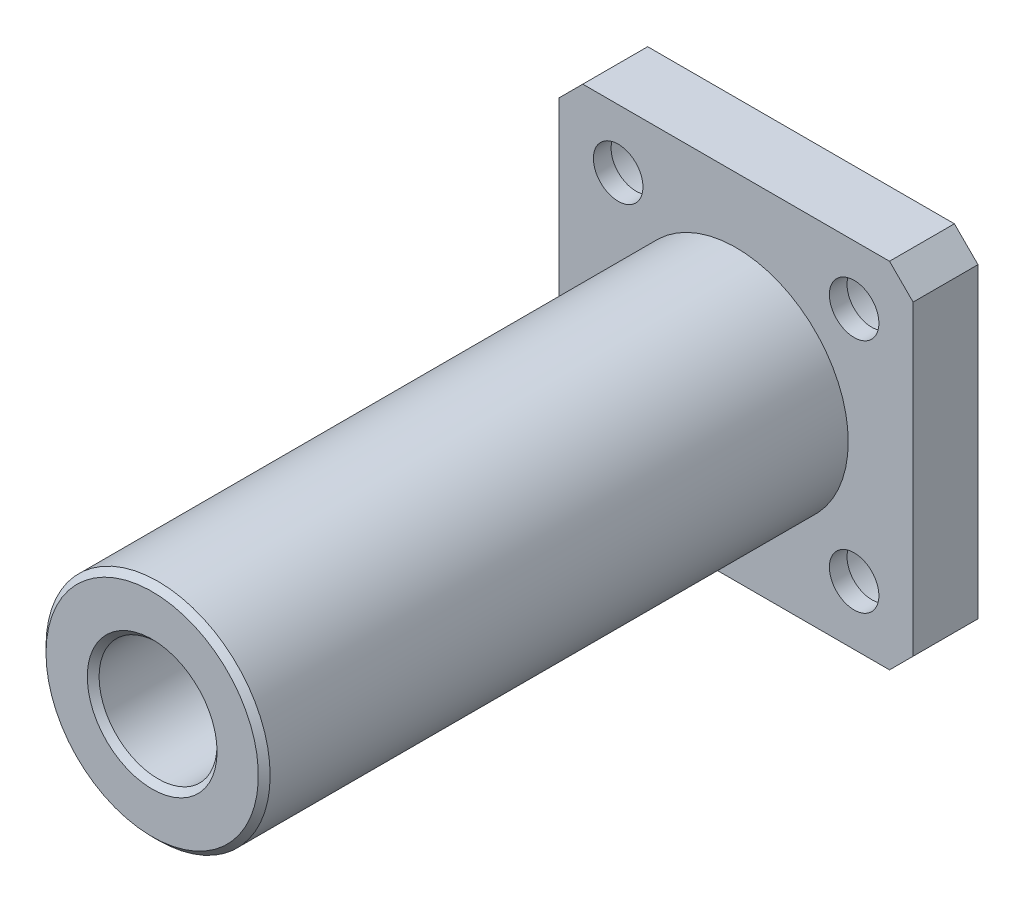
ISO-10303-21;
HEADER;
FILE_DESCRIPTION(('STEP AP214'),'2;1');
FILE_NAME('part.step','',(''),(''),'','','');
FILE_SCHEMA(('AUTOMOTIVE_DESIGN { 1 0 10303 214 1 1 1 1 }'));
ENDSEC;
DATA;
#1=APPLICATION_CONTEXT('core data for automotive mechanical design processes');
#2=APPLICATION_PROTOCOL_DEFINITION('international standard','automotive_design',2000,#1);
#3=PRODUCT_CONTEXT('',#1,'mechanical');
#4=PRODUCT('Part','Part','',(#3));
#5=PRODUCT_RELATED_PRODUCT_CATEGORY('part','',(#4));
#6=PRODUCT_DEFINITION_FORMATION('','',#4);
#7=PRODUCT_DEFINITION_CONTEXT('part definition',#1,'design');
#8=PRODUCT_DEFINITION('design','',#6,#7);
#9=PRODUCT_DEFINITION_SHAPE('','',#8);
#10=(LENGTH_UNIT() NAMED_UNIT(*) SI_UNIT(.MILLI.,.METRE.));
#11=(NAMED_UNIT(*) PLANE_ANGLE_UNIT() SI_UNIT($,.RADIAN.));
#12=(NAMED_UNIT(*) SI_UNIT($,.STERADIAN.) SOLID_ANGLE_UNIT());
#13=UNCERTAINTY_MEASURE_WITH_UNIT(LENGTH_MEASURE(1.E-05),#10,'distance_accuracy_value','');
#14=(GEOMETRIC_REPRESENTATION_CONTEXT(3) GLOBAL_UNCERTAINTY_ASSIGNED_CONTEXT((#13)) GLOBAL_UNIT_ASSIGNED_CONTEXT((#10,
#11,#12)) REPRESENTATION_CONTEXT('',''));
#15=CARTESIAN_POINT('',(0.,0.,0.));
#16=DIRECTION('',(0.,0.,1.));
#17=DIRECTION('',(1.,0.,0.));
#18=AXIS2_PLACEMENT_3D('',#15,#16,#17);
#19=CARTESIAN_POINT('',(0.,0.,0.));
#20=DIRECTION('',(0.,0.,-1.));
#21=DIRECTION('',(-1.,0.,0.));
#22=AXIS2_PLACEMENT_3D('',#19,#20,#21);
#23=CONICAL_SURFACE('',#22,5.49999999998363,0.785398163397448);
#24=CARTESIAN_POINT('',(0.,0.,0.));
#25=DIRECTION('',(0.,0.,-1.));
#26=DIRECTION('',(-1.,0.,0.));
#27=AXIS2_PLACEMENT_3D('',#24,#25,#26);
#28=CIRCLE('',#27,5.49999999998363);
#29=CARTESIAN_POINT('',(-5.49999999998363,0.,0.));
#30=VERTEX_POINT('',#29);
#31=EDGE_CURVE('E193',#30,#30,#28,.T.);
#32=ORIENTED_EDGE('',*,*,#31,.T.);
#33=EDGE_LOOP('',(#32));
#34=FACE_BOUND('',#33,.T.);
#35=CARTESIAN_POINT('',(0.,0.,0.5));
#36=DIRECTION('',(0.,0.,-1.));
#37=DIRECTION('',(-1.,0.,0.));
#38=AXIS2_PLACEMENT_3D('',#35,#36,#37);
#39=CIRCLE('',#38,5.);
#40=CARTESIAN_POINT('',(-5.,0.,0.5));
#41=VERTEX_POINT('',#40);
#42=EDGE_CURVE('E113',#41,#41,#39,.F.);
#43=ORIENTED_EDGE('',*,*,#42,.T.);
#44=EDGE_LOOP('',(#43));
#45=FACE_BOUND('',#44,.T.);
#46=ADVANCED_FACE('F17',(#34,#45),#23,.F.);
#47=CARTESIAN_POINT('',(-10.,-10.,2.));
#48=DIRECTION('',(0.,0.,-1.));
#49=DIRECTION('',(-1.,0.,0.));
#50=AXIS2_PLACEMENT_3D('',#47,#48,#49);
#51=CYLINDRICAL_SURFACE('',#50,4.);
#52=CARTESIAN_POINT('',(-10.,-10.,4.));
#53=DIRECTION('',(0.,0.,-1.));
#54=DIRECTION('',(-1.,0.,0.));
#55=AXIS2_PLACEMENT_3D('',#52,#53,#54);
#56=CIRCLE('',#55,4.);
#57=CARTESIAN_POINT('',(-14.,-10.,4.));
#58=VERTEX_POINT('',#57);
#59=EDGE_CURVE('E188',#58,#58,#56,.T.);
#60=ORIENTED_EDGE('',*,*,#59,.F.);
#61=EDGE_LOOP('',(#60));
#62=FACE_BOUND('',#61,.T.);
#63=CARTESIAN_POINT('',(-10.,-10.,0.));
#64=DIRECTION('',(0.,0.,-1.));
#65=DIRECTION('',(-1.,0.,0.));
#66=AXIS2_PLACEMENT_3D('',#63,#64,#65);
#67=CIRCLE('',#66,4.);
#68=CARTESIAN_POINT('',(-14.,-10.,0.));
#69=VERTEX_POINT('',#68);
#70=EDGE_CURVE('E198',#69,#69,#67,.T.);
#71=ORIENTED_EDGE('',*,*,#70,.T.);
#72=EDGE_LOOP('',(#71));
#73=FACE_BOUND('',#72,.T.);
#74=ADVANCED_FACE('F323',(#62,#73),#51,.F.);
#75=CARTESIAN_POINT('',(10.,10.,2.));
#76=DIRECTION('',(0.,0.,-1.));
#77=DIRECTION('',(-1.,0.,0.));
#78=AXIS2_PLACEMENT_3D('',#75,#76,#77);
#79=CYLINDRICAL_SURFACE('',#78,4.);
#80=CARTESIAN_POINT('',(10.,10.,4.));
#81=DIRECTION('',(0.,0.,-1.));
#82=DIRECTION('',(-1.,0.,0.));
#83=AXIS2_PLACEMENT_3D('',#80,#81,#82);
#84=CIRCLE('',#83,4.);
#85=CARTESIAN_POINT('',(6.,10.,4.));
#86=VERTEX_POINT('',#85);
#87=EDGE_CURVE('E183',#86,#86,#84,.T.);
#88=ORIENTED_EDGE('',*,*,#87,.F.);
#89=EDGE_LOOP('',(#88));
#90=FACE_BOUND('',#89,.T.);
#91=CARTESIAN_POINT('',(10.,10.,0.));
#92=DIRECTION('',(0.,0.,-1.));
#93=DIRECTION('',(-1.,0.,0.));
#94=AXIS2_PLACEMENT_3D('',#91,#92,#93);
#95=CIRCLE('',#94,4.);
#96=CARTESIAN_POINT('',(6.,10.,0.));
#97=VERTEX_POINT('',#96);
#98=EDGE_CURVE('E203',#97,#97,#95,.T.);
#99=ORIENTED_EDGE('',*,*,#98,.T.);
#100=EDGE_LOOP('',(#99));
#101=FACE_BOUND('',#100,.T.);
#102=ADVANCED_FACE('F319',(#90,#101),#79,.F.);
#103=CARTESIAN_POINT('',(10.,-10.,2.));
#104=DIRECTION('',(0.,0.,-1.));
#105=DIRECTION('',(-1.,0.,0.));
#106=AXIS2_PLACEMENT_3D('',#103,#104,#105);
#107=CYLINDRICAL_SURFACE('',#106,4.);
#108=CARTESIAN_POINT('',(10.,-10.,4.));
#109=DIRECTION('',(0.,0.,-1.));
#110=DIRECTION('',(-1.,0.,0.));
#111=AXIS2_PLACEMENT_3D('',#108,#109,#110);
#112=CIRCLE('',#111,4.);
#113=CARTESIAN_POINT('',(6.,-10.,4.));
#114=VERTEX_POINT('',#113);
#115=EDGE_CURVE('E178',#114,#114,#112,.T.);
#116=ORIENTED_EDGE('',*,*,#115,.F.);
#117=EDGE_LOOP('',(#116));
#118=FACE_BOUND('',#117,.T.);
#119=CARTESIAN_POINT('',(10.,-10.,0.));
#120=DIRECTION('',(0.,0.,-1.));
#121=DIRECTION('',(-1.,0.,0.));
#122=AXIS2_PLACEMENT_3D('',#119,#120,#121);
#123=CIRCLE('',#122,4.);
#124=CARTESIAN_POINT('',(6.,-10.,0.));
#125=VERTEX_POINT('',#124);
#126=EDGE_CURVE('E208',#125,#125,#123,.T.);
#127=ORIENTED_EDGE('',*,*,#126,.T.);
#128=EDGE_LOOP('',(#127));
#129=FACE_BOUND('',#128,.T.);
#130=ADVANCED_FACE('F322',(#118,#129),#107,.F.);
#131=CARTESIAN_POINT('',(-10.,10.,2.));
#132=DIRECTION('',(0.,0.,-1.));
#133=DIRECTION('',(-1.,0.,0.));
#134=AXIS2_PLACEMENT_3D('',#131,#132,#133);
#135=CYLINDRICAL_SURFACE('',#134,4.);
#136=CARTESIAN_POINT('',(-10.,10.,4.));
#137=DIRECTION('',(0.,0.,-1.));
#138=DIRECTION('',(-1.,0.,0.));
#139=AXIS2_PLACEMENT_3D('',#136,#137,#138);
#140=CIRCLE('',#139,4.);
#141=CARTESIAN_POINT('',(-14.,10.,4.));
#142=VERTEX_POINT('',#141);
#143=EDGE_CURVE('E110',#142,#142,#140,.T.);
#144=ORIENTED_EDGE('',*,*,#143,.F.);
#145=EDGE_LOOP('',(#144));
#146=FACE_BOUND('',#145,.T.);
#147=CARTESIAN_POINT('',(-10.,10.,0.));
#148=DIRECTION('',(0.,0.,-1.));
#149=DIRECTION('',(-1.,0.,0.));
#150=AXIS2_PLACEMENT_3D('',#147,#148,#149);
#151=CIRCLE('',#150,4.);
#152=CARTESIAN_POINT('',(-14.,10.,0.));
#153=VERTEX_POINT('',#152);
#154=EDGE_CURVE('E116',#153,#153,#151,.T.);
#155=ORIENTED_EDGE('',*,*,#154,.T.);
#156=EDGE_LOOP('',(#155));
#157=FACE_BOUND('',#156,.T.);
#158=ADVANCED_FACE('F217',(#146,#157),#135,.F.);
#159=CARTESIAN_POINT('',(0.,0.,55.));
#160=DIRECTION('',(0.,0.,-1.));
#161=DIRECTION('',(-1.,0.,0.));
#162=AXIS2_PLACEMENT_3D('',#159,#160,#161);
#163=CYLINDRICAL_SURFACE('',#162,5.);
#164=ORIENTED_EDGE('',*,*,#42,.F.);
#165=EDGE_LOOP('',(#164));
#166=FACE_BOUND('',#165,.T.);
#167=CARTESIAN_POINT('',(0.,0.,54.5000000000186));
#168=DIRECTION('',(0.,0.,1.));
#169=DIRECTION('',(-1.,0.,0.));
#170=AXIS2_PLACEMENT_3D('',#167,#168,#169);
#171=CIRCLE('',#170,4.99999999993861);
#172=CARTESIAN_POINT('',(-4.99999999993861,0.,54.5000000000186));
#173=VERTEX_POINT('',#172);
#174=EDGE_CURVE('E93',#173,#173,#171,.T.);
#175=ORIENTED_EDGE('',*,*,#174,.T.);
#176=EDGE_LOOP('',(#175));
#177=FACE_BOUND('',#176,.T.);
#178=ADVANCED_FACE('F221',(#166,#177),#163,.F.);
#179=CARTESIAN_POINT('',(0.,0.,0.));
#180=DIRECTION('',(0.,0.,1.));
#181=DIRECTION('',(1.,0.,0.));
#182=AXIS2_PLACEMENT_3D('',#179,#180,#181);
#183=PLANE('',#182);
#184=ORIENTED_EDGE('',*,*,#31,.F.);
#185=EDGE_LOOP('',(#184));
#186=FACE_BOUND('',#185,.T.);
#187=ORIENTED_EDGE('',*,*,#70,.F.);
#188=EDGE_LOOP('',(#187));
#189=FACE_BOUND('',#188,.T.);
#190=ORIENTED_EDGE('',*,*,#98,.F.);
#191=EDGE_LOOP('',(#190));
#192=FACE_BOUND('',#191,.T.);
#193=ORIENTED_EDGE('',*,*,#126,.F.);
#194=EDGE_LOOP('',(#193));
#195=FACE_BOUND('',#194,.T.);
#196=ORIENTED_EDGE('',*,*,#154,.F.);
#197=EDGE_LOOP('',(#196));
#198=FACE_BOUND('',#197,.T.);
#199=DIRECTION('',(0.,1.,0.));
#200=VECTOR('',#199,1.);
#201=CARTESIAN_POINT('',(15.,-15.,0.));
#202=LINE('',#201,#200);
#203=CARTESIAN_POINT('',(15.,-13.,0.));
#204=VERTEX_POINT('',#203);
#205=CARTESIAN_POINT('',(15.,13.,0.));
#206=VERTEX_POINT('',#205);
#207=EDGE_CURVE('E173',#204,#206,#202,.T.);
#208=ORIENTED_EDGE('',*,*,#207,.F.);
#209=DIRECTION('',(0.707106781186548,0.707106781186548,0.));
#210=VECTOR('',#209,1.);
#211=CARTESIAN_POINT('',(14.,-14.,0.));
#212=LINE('',#211,#210);
#213=CARTESIAN_POINT('',(13.,-15.,0.));
#214=VERTEX_POINT('',#213);
#215=EDGE_CURVE('E554',#214,#204,#212,.T.);
#216=ORIENTED_EDGE('',*,*,#215,.F.);
#217=DIRECTION('',(1.,0.,0.));
#218=VECTOR('',#217,1.);
#219=CARTESIAN_POINT('',(-15.,-15.,0.));
#220=LINE('',#219,#218);
#221=CARTESIAN_POINT('',(-13.,-15.,0.));
#222=VERTEX_POINT('',#221);
#223=EDGE_CURVE('E558',#222,#214,#220,.T.);
#224=ORIENTED_EDGE('',*,*,#223,.F.);
#225=DIRECTION('',(0.707106781186548,-0.707106781186548,0.));
#226=VECTOR('',#225,1.);
#227=CARTESIAN_POINT('',(-14.,-14.,0.));
#228=LINE('',#227,#226);
#229=CARTESIAN_POINT('',(-15.,-13.,0.));
#230=VERTEX_POINT('',#229);
#231=EDGE_CURVE('E563',#230,#222,#228,.T.);
#232=ORIENTED_EDGE('',*,*,#231,.F.);
#233=DIRECTION('',(0.,1.,0.));
#234=VECTOR('',#233,1.);
#235=CARTESIAN_POINT('',(-15.,15.,0.));
#236=LINE('',#235,#234);
#237=CARTESIAN_POINT('',(-15.,13.,0.));
#238=VERTEX_POINT('',#237);
#239=EDGE_CURVE('E568',#238,#230,#236,.F.);
#240=ORIENTED_EDGE('',*,*,#239,.F.);
#241=DIRECTION('',(-0.707106781186548,-0.707106781186548,0.));
#242=VECTOR('',#241,1.);
#243=CARTESIAN_POINT('',(-14.,14.,0.));
#244=LINE('',#243,#242);
#245=CARTESIAN_POINT('',(-13.,15.,0.));
#246=VERTEX_POINT('',#245);
#247=EDGE_CURVE('E97',#246,#238,#244,.T.);
#248=ORIENTED_EDGE('',*,*,#247,.F.);
#249=DIRECTION('',(1.,0.,0.));
#250=VECTOR('',#249,1.);
#251=CARTESIAN_POINT('',(15.,15.,0.));
#252=LINE('',#251,#250);
#253=CARTESIAN_POINT('',(13.,15.,0.));
#254=VERTEX_POINT('',#253);
#255=EDGE_CURVE('E79',#254,#246,#252,.F.);
#256=ORIENTED_EDGE('',*,*,#255,.F.);
#257=DIRECTION('',(-0.707106781186548,0.707106781186548,0.));
#258=VECTOR('',#257,1.);
#259=CARTESIAN_POINT('',(14.,14.,0.));
#260=LINE('',#259,#258);
#261=EDGE_CURVE('E84',#206,#254,#260,.T.);
#262=ORIENTED_EDGE('',*,*,#261,.F.);
#263=EDGE_LOOP('',(#208,#216,#224,#232,#240,#248,#256,#262));
#264=FACE_BOUND('',#263,.T.);
#265=ADVANCED_FACE('F95',(#186,#189,#192,#195,#198,#264),#183,.F.);
#266=CARTESIAN_POINT('',(-10.,-10.,4.));
#267=DIRECTION('',(0.,0.,-1.));
#268=DIRECTION('',(-1.,0.,0.));
#269=AXIS2_PLACEMENT_3D('',#266,#267,#268);
#270=PLANE('',#269);
#271=CARTESIAN_POINT('',(-10.,-10.,4.));
#272=DIRECTION('',(0.,0.,-1.));
#273=DIRECTION('',(-1.,0.,0.));
#274=AXIS2_PLACEMENT_3D('',#271,#272,#273);
#275=CIRCLE('',#274,2.1);
#276=CARTESIAN_POINT('',(-12.1,-10.,4.));
#277=VERTEX_POINT('',#276);
#278=EDGE_CURVE('E168',#277,#277,#275,.F.);
#279=ORIENTED_EDGE('',*,*,#278,.T.);
#280=EDGE_LOOP('',(#279));
#281=FACE_BOUND('',#280,.T.);
#282=ORIENTED_EDGE('',*,*,#59,.T.);
#283=EDGE_LOOP('',(#282));
#284=FACE_BOUND('',#283,.T.);
#285=ADVANCED_FACE('F220',(#281,#284),#270,.T.);
#286=CARTESIAN_POINT('',(10.,10.,4.));
#287=DIRECTION('',(0.,0.,-1.));
#288=DIRECTION('',(-1.,0.,0.));
#289=AXIS2_PLACEMENT_3D('',#286,#287,#288);
#290=PLANE('',#289);
#291=CARTESIAN_POINT('',(10.,10.,4.));
#292=DIRECTION('',(0.,0.,-1.));
#293=DIRECTION('',(-1.,0.,0.));
#294=AXIS2_PLACEMENT_3D('',#291,#292,#293);
#295=CIRCLE('',#294,2.1);
#296=CARTESIAN_POINT('',(7.9,10.,4.));
#297=VERTEX_POINT('',#296);
#298=EDGE_CURVE('E163',#297,#297,#295,.F.);
#299=ORIENTED_EDGE('',*,*,#298,.T.);
#300=EDGE_LOOP('',(#299));
#301=FACE_BOUND('',#300,.T.);
#302=ORIENTED_EDGE('',*,*,#87,.T.);
#303=EDGE_LOOP('',(#302));
#304=FACE_BOUND('',#303,.T.);
#305=ADVANCED_FACE('F229',(#301,#304),#290,.T.);
#306=CARTESIAN_POINT('',(10.,-10.,4.));
#307=DIRECTION('',(0.,0.,-1.));
#308=DIRECTION('',(-1.,0.,0.));
#309=AXIS2_PLACEMENT_3D('',#306,#307,#308);
#310=PLANE('',#309);
#311=CARTESIAN_POINT('',(10.,-10.,4.));
#312=DIRECTION('',(0.,0.,-1.));
#313=DIRECTION('',(-1.,0.,0.));
#314=AXIS2_PLACEMENT_3D('',#311,#312,#313);
#315=CIRCLE('',#314,2.1);
#316=CARTESIAN_POINT('',(7.9,-10.,4.));
#317=VERTEX_POINT('',#316);
#318=EDGE_CURVE('E158',#317,#317,#315,.F.);
#319=ORIENTED_EDGE('',*,*,#318,.T.);
#320=EDGE_LOOP('',(#319));
#321=FACE_BOUND('',#320,.T.);
#322=ORIENTED_EDGE('',*,*,#115,.T.);
#323=EDGE_LOOP('',(#322));
#324=FACE_BOUND('',#323,.T.);
#325=ADVANCED_FACE('F306',(#321,#324),#310,.T.);
#326=CARTESIAN_POINT('',(-10.,10.,4.));
#327=DIRECTION('',(0.,0.,-1.));
#328=DIRECTION('',(-1.,0.,0.));
#329=AXIS2_PLACEMENT_3D('',#326,#327,#328);
#330=PLANE('',#329);
#331=CARTESIAN_POINT('',(-10.,10.,4.));
#332=DIRECTION('',(0.,0.,-1.));
#333=DIRECTION('',(-1.,0.,0.));
#334=AXIS2_PLACEMENT_3D('',#331,#332,#333);
#335=CIRCLE('',#334,2.1);
#336=CARTESIAN_POINT('',(-12.1,10.,4.));
#337=VERTEX_POINT('',#336);
#338=EDGE_CURVE('E153',#337,#337,#335,.F.);
#339=ORIENTED_EDGE('',*,*,#338,.T.);
#340=EDGE_LOOP('',(#339));
#341=FACE_BOUND('',#340,.T.);
#342=ORIENTED_EDGE('',*,*,#143,.T.);
#343=EDGE_LOOP('',(#342));
#344=FACE_BOUND('',#343,.T.);
#345=ADVANCED_FACE('F302',(#341,#344),#330,.T.);
#346=CARTESIAN_POINT('',(0.,0.,54.99999999995));
#347=DIRECTION('',(0.,0.,1.));
#348=DIRECTION('',(1.,0.,0.));
#349=AXIS2_PLACEMENT_3D('',#346,#347,#348);
#350=CONICAL_SURFACE('',#349,5.49999999986994,0.785398163340605);
#351=CARTESIAN_POINT('',(0.,0.,55.0000000000068));
#352=DIRECTION('',(0.,0.,1.));
#353=DIRECTION('',(1.,0.,0.));
#354=AXIS2_PLACEMENT_3D('',#351,#352,#353);
#355=CIRCLE('',#354,5.49999999992679);
#356=CARTESIAN_POINT('',(5.49999999992679,0.,55.0000000000068));
#357=VERTEX_POINT('',#356);
#358=EDGE_CURVE('E149',#357,#357,#355,.F.);
#359=ORIENTED_EDGE('',*,*,#358,.F.);
#360=EDGE_LOOP('',(#359));
#361=FACE_BOUND('',#360,.T.);
#362=ORIENTED_EDGE('',*,*,#174,.F.);
#363=EDGE_LOOP('',(#362));
#364=FACE_BOUND('',#363,.T.);
#365=ADVANCED_FACE('F299',(#361,#364),#350,.F.);
#366=CARTESIAN_POINT('',(14.,14.,0.));
#367=DIRECTION('',(0.707106781186548,0.707106781186548,0.));
#368=DIRECTION('',(-0.707106781186548,0.707106781186548,0.));
#369=AXIS2_PLACEMENT_3D('',#366,#367,#368);
#370=PLANE('',#369);
#371=ORIENTED_EDGE('',*,*,#261,.T.);
#372=DIRECTION('',(0.,0.,1.));
#373=VECTOR('',#372,1.);
#374=CARTESIAN_POINT('',(13.,15.,0.));
#375=LINE('',#374,#373);
#376=CARTESIAN_POINT('',(13.,15.,5.5));
#377=VERTEX_POINT('',#376);
#378=EDGE_CURVE('E86',#377,#254,#375,.F.);
#379=ORIENTED_EDGE('',*,*,#378,.F.);
#380=DIRECTION('',(-0.707106781186548,0.707106781186548,0.));
#381=VECTOR('',#380,1.);
#382=CARTESIAN_POINT('',(15.,13.,5.5));
#383=LINE('',#382,#381);
#384=CARTESIAN_POINT('',(15.,13.,5.5));
#385=VERTEX_POINT('',#384);
#386=EDGE_CURVE('E152',#385,#377,#383,.T.);
#387=ORIENTED_EDGE('',*,*,#386,.F.);
#388=DIRECTION('',(0.,0.,-1.));
#389=VECTOR('',#388,1.);
#390=CARTESIAN_POINT('',(15.,13.,0.));
#391=LINE('',#390,#389);
#392=EDGE_CURVE('E89',#206,#385,#391,.F.);
#393=ORIENTED_EDGE('',*,*,#392,.F.);
#394=EDGE_LOOP('',(#371,#379,#387,#393));
#395=FACE_BOUND('',#394,.T.);
#396=ADVANCED_FACE('F85',(#395),#370,.T.);
#397=CARTESIAN_POINT('',(15.,15.,0.));
#398=DIRECTION('',(0.,1.,0.));
#399=DIRECTION('',(0.,0.,1.));
#400=AXIS2_PLACEMENT_3D('',#397,#398,#399);
#401=PLANE('',#400);
#402=DIRECTION('',(0.,0.,1.));
#403=VECTOR('',#402,1.);
#404=CARTESIAN_POINT('',(-13.,15.,0.));
#405=LINE('',#404,#403);
#406=CARTESIAN_POINT('',(-13.,15.,5.5));
#407=VERTEX_POINT('',#406);
#408=EDGE_CURVE('E99',#407,#246,#405,.F.);
#409=ORIENTED_EDGE('',*,*,#408,.F.);
#410=DIRECTION('',(1.,0.,0.));
#411=VECTOR('',#410,1.);
#412=CARTESIAN_POINT('',(0.,15.,5.5));
#413=LINE('',#412,#411);
#414=EDGE_CURVE('E103',#377,#407,#413,.F.);
#415=ORIENTED_EDGE('',*,*,#414,.F.);
#416=ORIENTED_EDGE('',*,*,#378,.T.);
#417=ORIENTED_EDGE('',*,*,#255,.T.);
#418=EDGE_LOOP('',(#409,#415,#416,#417));
#419=FACE_BOUND('',#418,.T.);
#420=ADVANCED_FACE('F101',(#419),#401,.T.);
#421=CARTESIAN_POINT('',(-14.,14.,0.));
#422=DIRECTION('',(-0.707106781186548,0.707106781186548,0.));
#423=DIRECTION('',(-0.707106781186548,-0.707106781186548,0.));
#424=AXIS2_PLACEMENT_3D('',#421,#422,#423);
#425=PLANE('',#424);
#426=ORIENTED_EDGE('',*,*,#247,.T.);
#427=DIRECTION('',(0.,0.,1.));
#428=VECTOR('',#427,1.);
#429=CARTESIAN_POINT('',(-15.,13.,0.));
#430=LINE('',#429,#428);
#431=CARTESIAN_POINT('',(-15.,13.,5.5));
#432=VERTEX_POINT('',#431);
#433=EDGE_CURVE('E570',#432,#238,#430,.F.);
#434=ORIENTED_EDGE('',*,*,#433,.F.);
#435=DIRECTION('',(-0.707106781186548,-0.707106781186548,0.));
#436=VECTOR('',#435,1.);
#437=CARTESIAN_POINT('',(-13.,15.,5.5));
#438=LINE('',#437,#436);
#439=EDGE_CURVE('E546',#407,#432,#438,.T.);
#440=ORIENTED_EDGE('',*,*,#439,.F.);
#441=ORIENTED_EDGE('',*,*,#408,.T.);
#442=EDGE_LOOP('',(#426,#434,#440,#441));
#443=FACE_BOUND('',#442,.T.);
#444=ADVANCED_FACE('F290',(#443),#425,.T.);
#445=CARTESIAN_POINT('',(-15.,15.,0.));
#446=DIRECTION('',(-1.,0.,0.));
#447=DIRECTION('',(0.,0.,1.));
#448=AXIS2_PLACEMENT_3D('',#445,#446,#447);
#449=PLANE('',#448);
#450=DIRECTION('',(0.,0.,1.));
#451=VECTOR('',#450,1.);
#452=CARTESIAN_POINT('',(-15.,-13.,0.));
#453=LINE('',#452,#451);
#454=CARTESIAN_POINT('',(-15.,-13.,5.5));
#455=VERTEX_POINT('',#454);
#456=EDGE_CURVE('E565',#455,#230,#453,.F.);
#457=ORIENTED_EDGE('',*,*,#456,.F.);
#458=DIRECTION('',(0.,1.,0.));
#459=VECTOR('',#458,1.);
#460=CARTESIAN_POINT('',(-15.,0.,5.5));
#461=LINE('',#460,#459);
#462=EDGE_CURVE('E543',#432,#455,#461,.F.);
#463=ORIENTED_EDGE('',*,*,#462,.F.);
#464=ORIENTED_EDGE('',*,*,#433,.T.);
#465=ORIENTED_EDGE('',*,*,#239,.T.);
#466=EDGE_LOOP('',(#457,#463,#464,#465));
#467=FACE_BOUND('',#466,.T.);
#468=ADVANCED_FACE('F286',(#467),#449,.T.);
#469=CARTESIAN_POINT('',(-14.,-14.,0.));
#470=DIRECTION('',(-0.707106781186548,-0.707106781186548,0.));
#471=DIRECTION('',(0.707106781186548,-0.707106781186548,0.));
#472=AXIS2_PLACEMENT_3D('',#469,#470,#471);
#473=PLANE('',#472);
#474=ORIENTED_EDGE('',*,*,#231,.T.);
#475=DIRECTION('',(0.,0.,-1.));
#476=VECTOR('',#475,1.);
#477=CARTESIAN_POINT('',(-13.,-15.,0.));
#478=LINE('',#477,#476);
#479=CARTESIAN_POINT('',(-13.,-15.,5.5));
#480=VERTEX_POINT('',#479);
#481=EDGE_CURVE('E560',#480,#222,#478,.T.);
#482=ORIENTED_EDGE('',*,*,#481,.F.);
#483=DIRECTION('',(0.707106781186548,-0.707106781186548,0.));
#484=VECTOR('',#483,1.);
#485=CARTESIAN_POINT('',(-15.,-13.,5.5));
#486=LINE('',#485,#484);
#487=EDGE_CURVE('E538',#455,#480,#486,.T.);
#488=ORIENTED_EDGE('',*,*,#487,.F.);
#489=ORIENTED_EDGE('',*,*,#456,.T.);
#490=EDGE_LOOP('',(#474,#482,#488,#489));
#491=FACE_BOUND('',#490,.T.);
#492=ADVANCED_FACE('F282',(#491),#473,.T.);
#493=CARTESIAN_POINT('',(-15.,-15.,0.));
#494=DIRECTION('',(0.,-1.,0.));
#495=DIRECTION('',(0.,0.,-1.));
#496=AXIS2_PLACEMENT_3D('',#493,#494,#495);
#497=PLANE('',#496);
#498=DIRECTION('',(0.,0.,1.));
#499=VECTOR('',#498,1.);
#500=CARTESIAN_POINT('',(13.,-15.,0.));
#501=LINE('',#500,#499);
#502=CARTESIAN_POINT('',(13.,-15.,5.5));
#503=VERTEX_POINT('',#502);
#504=EDGE_CURVE('E556',#503,#214,#501,.F.);
#505=ORIENTED_EDGE('',*,*,#504,.F.);
#506=DIRECTION('',(1.,0.,0.));
#507=VECTOR('',#506,1.);
#508=CARTESIAN_POINT('',(0.,-15.,5.5));
#509=LINE('',#508,#507);
#510=EDGE_CURVE('E534',#480,#503,#509,.T.);
#511=ORIENTED_EDGE('',*,*,#510,.F.);
#512=ORIENTED_EDGE('',*,*,#481,.T.);
#513=ORIENTED_EDGE('',*,*,#223,.T.);
#514=EDGE_LOOP('',(#505,#511,#512,#513));
#515=FACE_BOUND('',#514,.T.);
#516=ADVANCED_FACE('F279',(#515),#497,.T.);
#517=CARTESIAN_POINT('',(14.,-14.,0.));
#518=DIRECTION('',(0.707106781186548,-0.707106781186548,0.));
#519=DIRECTION('',(0.707106781186548,0.707106781186548,0.));
#520=AXIS2_PLACEMENT_3D('',#517,#518,#519);
#521=PLANE('',#520);
#522=ORIENTED_EDGE('',*,*,#215,.T.);
#523=DIRECTION('',(0.,0.,-1.));
#524=VECTOR('',#523,1.);
#525=CARTESIAN_POINT('',(15.,-13.,0.));
#526=LINE('',#525,#524);
#527=CARTESIAN_POINT('',(15.,-13.,5.5));
#528=VERTEX_POINT('',#527);
#529=EDGE_CURVE('E35',#528,#204,#526,.T.);
#530=ORIENTED_EDGE('',*,*,#529,.F.);
#531=DIRECTION('',(0.707106781186548,0.707106781186548,0.));
#532=VECTOR('',#531,1.);
#533=CARTESIAN_POINT('',(13.,-15.,5.5));
#534=LINE('',#533,#532);
#535=EDGE_CURVE('E531',#503,#528,#534,.T.);
#536=ORIENTED_EDGE('',*,*,#535,.F.);
#537=ORIENTED_EDGE('',*,*,#504,.T.);
#538=EDGE_LOOP('',(#522,#530,#536,#537));
#539=FACE_BOUND('',#538,.T.);
#540=ADVANCED_FACE('F275',(#539),#521,.T.);
#541=CARTESIAN_POINT('',(15.,-15.,0.));
#542=DIRECTION('',(1.,0.,0.));
#543=DIRECTION('',(0.,0.,-1.));
#544=AXIS2_PLACEMENT_3D('',#541,#542,#543);
#545=PLANE('',#544);
#546=ORIENTED_EDGE('',*,*,#529,.T.);
#547=ORIENTED_EDGE('',*,*,#207,.T.);
#548=ORIENTED_EDGE('',*,*,#392,.T.);
#549=DIRECTION('',(0.,1.,0.));
#550=VECTOR('',#549,1.);
#551=CARTESIAN_POINT('',(15.,0.,5.5));
#552=LINE('',#551,#550);
#553=EDGE_CURVE('E146',#528,#385,#552,.T.);
#554=ORIENTED_EDGE('',*,*,#553,.F.);
#555=EDGE_LOOP('',(#546,#547,#548,#554));
#556=FACE_BOUND('',#555,.T.);
#557=ADVANCED_FACE('F271',(#556),#545,.T.);
#558=CARTESIAN_POINT('',(-10.,-10.,4.));
#559=DIRECTION('',(0.,0.,-1.));
#560=DIRECTION('',(-1.,0.,0.));
#561=AXIS2_PLACEMENT_3D('',#558,#559,#560);
#562=CYLINDRICAL_SURFACE('',#561,2.1);
#563=ORIENTED_EDGE('',*,*,#278,.F.);
#564=EDGE_LOOP('',(#563));
#565=FACE_BOUND('',#564,.T.);
#566=CARTESIAN_POINT('',(-10.,-10.,5.5));
#567=DIRECTION('',(0.,0.,-1.));
#568=DIRECTION('',(-1.,0.,0.));
#569=AXIS2_PLACEMENT_3D('',#566,#567,#568);
#570=CIRCLE('',#569,2.1);
#571=CARTESIAN_POINT('',(-12.1,-10.,5.5));
#572=VERTEX_POINT('',#571);
#573=EDGE_CURVE('E141',#572,#572,#570,.T.);
#574=ORIENTED_EDGE('',*,*,#573,.F.);
#575=EDGE_LOOP('',(#574));
#576=FACE_BOUND('',#575,.T.);
#577=ADVANCED_FACE('F267',(#565,#576),#562,.F.);
#578=CARTESIAN_POINT('',(10.,10.,4.));
#579=DIRECTION('',(0.,0.,-1.));
#580=DIRECTION('',(-1.,0.,0.));
#581=AXIS2_PLACEMENT_3D('',#578,#579,#580);
#582=CYLINDRICAL_SURFACE('',#581,2.1);
#583=ORIENTED_EDGE('',*,*,#298,.F.);
#584=EDGE_LOOP('',(#583));
#585=FACE_BOUND('',#584,.T.);
#586=CARTESIAN_POINT('',(10.,10.,5.5));
#587=DIRECTION('',(0.,0.,-1.));
#588=DIRECTION('',(-1.,0.,0.));
#589=AXIS2_PLACEMENT_3D('',#586,#587,#588);
#590=CIRCLE('',#589,2.1);
#591=CARTESIAN_POINT('',(7.9,10.,5.5));
#592=VERTEX_POINT('',#591);
#593=EDGE_CURVE('E136',#592,#592,#590,.T.);
#594=ORIENTED_EDGE('',*,*,#593,.F.);
#595=EDGE_LOOP('',(#594));
#596=FACE_BOUND('',#595,.T.);
#597=ADVANCED_FACE('F263',(#585,#596),#582,.F.);
#598=CARTESIAN_POINT('',(10.,-10.,4.));
#599=DIRECTION('',(0.,0.,-1.));
#600=DIRECTION('',(-1.,0.,0.));
#601=AXIS2_PLACEMENT_3D('',#598,#599,#600);
#602=CYLINDRICAL_SURFACE('',#601,2.1);
#603=ORIENTED_EDGE('',*,*,#318,.F.);
#604=EDGE_LOOP('',(#603));
#605=FACE_BOUND('',#604,.T.);
#606=CARTESIAN_POINT('',(10.,-10.,5.5));
#607=DIRECTION('',(0.,0.,-1.));
#608=DIRECTION('',(-1.,0.,0.));
#609=AXIS2_PLACEMENT_3D('',#606,#607,#608);
#610=CIRCLE('',#609,2.1);
#611=CARTESIAN_POINT('',(7.9,-10.,5.5));
#612=VERTEX_POINT('',#611);
#613=EDGE_CURVE('E131',#612,#612,#610,.T.);
#614=ORIENTED_EDGE('',*,*,#613,.F.);
#615=EDGE_LOOP('',(#614));
#616=FACE_BOUND('',#615,.T.);
#617=ADVANCED_FACE('F259',(#605,#616),#602,.F.);
#618=CARTESIAN_POINT('',(-10.,10.,4.));
#619=DIRECTION('',(0.,0.,-1.));
#620=DIRECTION('',(-1.,0.,0.));
#621=AXIS2_PLACEMENT_3D('',#618,#619,#620);
#622=CYLINDRICAL_SURFACE('',#621,2.1);
#623=ORIENTED_EDGE('',*,*,#338,.F.);
#624=EDGE_LOOP('',(#623));
#625=FACE_BOUND('',#624,.T.);
#626=CARTESIAN_POINT('',(-10.,10.,5.5));
#627=DIRECTION('',(0.,0.,-1.));
#628=DIRECTION('',(-1.,0.,0.));
#629=AXIS2_PLACEMENT_3D('',#626,#627,#628);
#630=CIRCLE('',#629,2.1);
#631=CARTESIAN_POINT('',(-12.1,10.,5.5));
#632=VERTEX_POINT('',#631);
#633=EDGE_CURVE('E126',#632,#632,#630,.T.);
#634=ORIENTED_EDGE('',*,*,#633,.F.);
#635=EDGE_LOOP('',(#634));
#636=FACE_BOUND('',#635,.T.);
#637=ADVANCED_FACE('F255',(#625,#636),#622,.F.);
#638=CARTESIAN_POINT('',(0.,0.,55.));
#639=DIRECTION('',(0.,0.,1.));
#640=DIRECTION('',(1.,0.,0.));
#641=AXIS2_PLACEMENT_3D('',#638,#639,#640);
#642=PLANE('',#641);
#643=ORIENTED_EDGE('',*,*,#358,.T.);
#644=EDGE_LOOP('',(#643));
#645=FACE_BOUND('',#644,.T.);
#646=CARTESIAN_POINT('',(0.,0.,54.9999999999994));
#647=DIRECTION('',(0.,0.,-1.));
#648=DIRECTION('',(-1.,0.,0.));
#649=AXIS2_PLACEMENT_3D('',#646,#647,#648);
#650=CIRCLE('',#649,8.99999999999936);
#651=CARTESIAN_POINT('',(-8.99999999999936,0.,54.9999999999994));
#652=VERTEX_POINT('',#651);
#653=EDGE_CURVE('E121',#652,#652,#650,.T.);
#654=ORIENTED_EDGE('',*,*,#653,.F.);
#655=EDGE_LOOP('',(#654));
#656=FACE_BOUND('',#655,.T.);
#657=ADVANCED_FACE('F251',(#645,#656),#642,.T.);
#658=CARTESIAN_POINT('',(0.,0.,5.5));
#659=DIRECTION('',(0.,0.,1.));
#660=DIRECTION('',(1.,0.,0.));
#661=AXIS2_PLACEMENT_3D('',#658,#659,#660);
#662=PLANE('',#661);
#663=CARTESIAN_POINT('',(0.,0.,5.5));
#664=DIRECTION('',(0.,0.,1.));
#665=DIRECTION('',(1.,0.,0.));
#666=AXIS2_PLACEMENT_3D('',#663,#664,#665);
#667=CIRCLE('',#666,9.5);
#668=CARTESIAN_POINT('',(9.5,0.,5.5));
#669=VERTEX_POINT('',#668);
#670=EDGE_CURVE('E26',#669,#669,#667,.T.);
#671=ORIENTED_EDGE('',*,*,#670,.F.);
#672=EDGE_LOOP('',(#671));
#673=FACE_BOUND('',#672,.T.);
#674=ORIENTED_EDGE('',*,*,#633,.T.);
#675=EDGE_LOOP('',(#674));
#676=FACE_BOUND('',#675,.T.);
#677=ORIENTED_EDGE('',*,*,#613,.T.);
#678=EDGE_LOOP('',(#677));
#679=FACE_BOUND('',#678,.T.);
#680=ORIENTED_EDGE('',*,*,#593,.T.);
#681=EDGE_LOOP('',(#680));
#682=FACE_BOUND('',#681,.T.);
#683=ORIENTED_EDGE('',*,*,#573,.T.);
#684=EDGE_LOOP('',(#683));
#685=FACE_BOUND('',#684,.T.);
#686=ORIENTED_EDGE('',*,*,#535,.T.);
#687=ORIENTED_EDGE('',*,*,#553,.T.);
#688=ORIENTED_EDGE('',*,*,#386,.T.);
#689=ORIENTED_EDGE('',*,*,#414,.T.);
#690=ORIENTED_EDGE('',*,*,#439,.T.);
#691=ORIENTED_EDGE('',*,*,#462,.T.);
#692=ORIENTED_EDGE('',*,*,#487,.T.);
#693=ORIENTED_EDGE('',*,*,#510,.T.);
#694=EDGE_LOOP('',(#686,#687,#688,#689,#690,#691,#692,#693));
#695=FACE_BOUND('',#694,.T.);
#696=ADVANCED_FACE('F244',(#673,#676,#679,#682,#685,#695),#662,.T.);
#697=CARTESIAN_POINT('',(0.,0.,54.5000000000006));
#698=DIRECTION('',(0.,0.,-1.));
#699=DIRECTION('',(-1.,0.,0.));
#700=AXIS2_PLACEMENT_3D('',#697,#698,#699);
#701=CONICAL_SURFACE('',#700,9.50000000000064,0.785398163400002);
#702=ORIENTED_EDGE('',*,*,#653,.T.);
#703=EDGE_LOOP('',(#702));
#704=FACE_BOUND('',#703,.T.);
#705=CARTESIAN_POINT('',(0.,0.,54.5));
#706=DIRECTION('',(0.,0.,1.));
#707=DIRECTION('',(1.,0.,0.));
#708=AXIS2_PLACEMENT_3D('',#705,#706,#707);
#709=CIRCLE('',#708,9.5);
#710=CARTESIAN_POINT('',(9.5,0.,54.5));
#711=VERTEX_POINT('',#710);
#712=EDGE_CURVE('E11',#711,#711,#709,.F.);
#713=ORIENTED_EDGE('',*,*,#712,.F.);
#714=EDGE_LOOP('',(#713));
#715=FACE_BOUND('',#714,.T.);
#716=ADVANCED_FACE('F238',(#704,#715),#701,.T.);
#717=CARTESIAN_POINT('',(0.,0.,5.5));
#718=DIRECTION('',(0.,0.,1.));
#719=DIRECTION('',(1.,0.,0.));
#720=AXIS2_PLACEMENT_3D('',#717,#718,#719);
#721=CYLINDRICAL_SURFACE('',#720,9.5);
#722=ORIENTED_EDGE('',*,*,#712,.T.);
#723=EDGE_LOOP('',(#722));
#724=FACE_BOUND('',#723,.T.);
#725=ORIENTED_EDGE('',*,*,#670,.T.);
#726=EDGE_LOOP('',(#725));
#727=FACE_BOUND('',#726,.T.);
#728=ADVANCED_FACE('F236',(#724,#727),#721,.T.);
#729=CLOSED_SHELL('',(#46,#74,#102,#130,#158,#178,#265,#285,#305,#325,#345,#365,#396,#420,#444,
#468,#492,#516,#540,#557,#577,#597,#617,#637,#657,#696,#716,#728));
#730=MANIFOLD_SOLID_BREP('B1',#729);
#731=ADVANCED_BREP_SHAPE_REPRESENTATION('',(#18,#730),#14);
#732=SHAPE_DEFINITION_REPRESENTATION(#9,#731);
ENDSEC;
END-ISO-10303-21;
